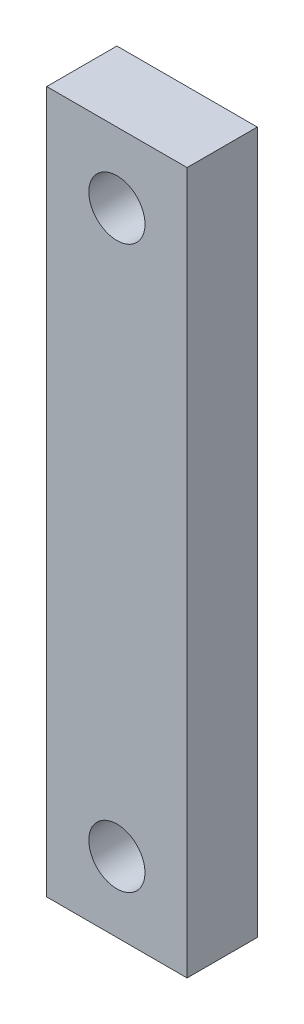
ISO-10303-21;
HEADER;
FILE_DESCRIPTION(('STEP AP214'),'2;1');
FILE_NAME('part.step','',(''),(''),'','','');
FILE_SCHEMA(('AUTOMOTIVE_DESIGN { 1 0 10303 214 1 1 1 1 }'));
ENDSEC;
DATA;
#1=APPLICATION_CONTEXT('core data for automotive mechanical design processes');
#2=APPLICATION_PROTOCOL_DEFINITION('international standard','automotive_design',2000,#1);
#3=PRODUCT_CONTEXT('',#1,'mechanical');
#4=PRODUCT('Part','Part','',(#3));
#5=PRODUCT_RELATED_PRODUCT_CATEGORY('part','',(#4));
#6=PRODUCT_DEFINITION_FORMATION('','',#4);
#7=PRODUCT_DEFINITION_CONTEXT('part definition',#1,'design');
#8=PRODUCT_DEFINITION('design','',#6,#7);
#9=PRODUCT_DEFINITION_SHAPE('','',#8);
#10=(LENGTH_UNIT() NAMED_UNIT(*) SI_UNIT(.MILLI.,.METRE.));
#11=(NAMED_UNIT(*) PLANE_ANGLE_UNIT() SI_UNIT($,.RADIAN.));
#12=(NAMED_UNIT(*) SI_UNIT($,.STERADIAN.) SOLID_ANGLE_UNIT());
#13=UNCERTAINTY_MEASURE_WITH_UNIT(LENGTH_MEASURE(1.E-05),#10,'distance_accuracy_value','');
#14=(GEOMETRIC_REPRESENTATION_CONTEXT(3) GLOBAL_UNCERTAINTY_ASSIGNED_CONTEXT((#13)) GLOBAL_UNIT_ASSIGNED_CONTEXT((#10,
#11,#12)) REPRESENTATION_CONTEXT('',''));
#15=CARTESIAN_POINT('',(0.,0.,0.));
#16=DIRECTION('',(0.,0.,1.));
#17=DIRECTION('',(1.,0.,0.));
#18=AXIS2_PLACEMENT_3D('',#15,#16,#17);
#19=CARTESIAN_POINT('',(0.,0.,10.));
#20=DIRECTION('',(1.,0.,0.));
#21=DIRECTION('',(0.,0.,-1.));
#22=AXIS2_PLACEMENT_3D('',#19,#20,#21);
#23=PLANE('',#22);
#24=DIRECTION('',(0.,-1.,0.));
#25=VECTOR('',#24,1.);
#26=CARTESIAN_POINT('',(0.,0.,0.));
#27=LINE('',#26,#25);
#28=CARTESIAN_POINT('',(0.,100.,0.));
#29=VERTEX_POINT('',#28);
#30=CARTESIAN_POINT('',(0.,0.,0.));
#31=VERTEX_POINT('',#30);
#32=EDGE_CURVE('E107',#29,#31,#27,.T.);
#33=ORIENTED_EDGE('',*,*,#32,.T.);
#34=DIRECTION('',(0.,0.,-1.));
#35=VECTOR('',#34,1.);
#36=CARTESIAN_POINT('',(0.,0.,10.));
#37=LINE('',#36,#35);
#38=CARTESIAN_POINT('',(0.,0.,10.));
#39=VERTEX_POINT('',#38);
#40=EDGE_CURVE('E11',#39,#31,#37,.T.);
#41=ORIENTED_EDGE('',*,*,#40,.F.);
#42=DIRECTION('',(0.,-1.,0.));
#43=VECTOR('',#42,1.);
#44=CARTESIAN_POINT('',(0.,0.,10.));
#45=LINE('',#44,#43);
#46=CARTESIAN_POINT('',(0.,100.,10.));
#47=VERTEX_POINT('',#46);
#48=EDGE_CURVE('E91',#47,#39,#45,.T.);
#49=ORIENTED_EDGE('',*,*,#48,.F.);
#50=DIRECTION('',(0.,0.,-1.));
#51=VECTOR('',#50,1.);
#52=CARTESIAN_POINT('',(0.,100.,10.));
#53=LINE('',#52,#51);
#54=EDGE_CURVE('E103',#47,#29,#53,.T.);
#55=ORIENTED_EDGE('',*,*,#54,.T.);
#56=EDGE_LOOP('',(#33,#41,#49,#55));
#57=FACE_BOUND('',#56,.T.);
#58=ADVANCED_FACE('F39',(#57),#23,.F.);
#59=CARTESIAN_POINT('',(0.,0.,10.));
#60=DIRECTION('',(0.,1.,0.));
#61=DIRECTION('',(0.,0.,1.));
#62=AXIS2_PLACEMENT_3D('',#59,#60,#61);
#63=PLANE('',#62);
#64=DIRECTION('',(1.,0.,0.));
#65=VECTOR('',#64,1.);
#66=CARTESIAN_POINT('',(0.,0.,0.));
#67=LINE('',#66,#65);
#68=CARTESIAN_POINT('',(20.,0.,0.));
#69=VERTEX_POINT('',#68);
#70=EDGE_CURVE('E96',#31,#69,#67,.T.);
#71=ORIENTED_EDGE('',*,*,#70,.T.);
#72=DIRECTION('',(0.,0.,-1.));
#73=VECTOR('',#72,1.);
#74=CARTESIAN_POINT('',(20.,0.,10.));
#75=LINE('',#74,#73);
#76=CARTESIAN_POINT('',(20.,0.,10.));
#77=VERTEX_POINT('',#76);
#78=EDGE_CURVE('E48',#77,#69,#75,.T.);
#79=ORIENTED_EDGE('',*,*,#78,.F.);
#80=DIRECTION('',(1.,0.,0.));
#81=VECTOR('',#80,1.);
#82=CARTESIAN_POINT('',(0.,0.,10.));
#83=LINE('',#82,#81);
#84=EDGE_CURVE('E86',#39,#77,#83,.T.);
#85=ORIENTED_EDGE('',*,*,#84,.F.);
#86=ORIENTED_EDGE('',*,*,#40,.T.);
#87=EDGE_LOOP('',(#71,#79,#85,#86));
#88=FACE_BOUND('',#87,.T.);
#89=ADVANCED_FACE('F95',(#88),#63,.F.);
#90=CARTESIAN_POINT('',(20.,0.,10.));
#91=DIRECTION('',(-1.,0.,0.));
#92=DIRECTION('',(0.,0.,1.));
#93=AXIS2_PLACEMENT_3D('',#90,#91,#92);
#94=PLANE('',#93);
#95=DIRECTION('',(0.,1.,0.));
#96=VECTOR('',#95,1.);
#97=CARTESIAN_POINT('',(20.,0.,0.));
#98=LINE('',#97,#96);
#99=CARTESIAN_POINT('',(20.,100.,0.));
#100=VERTEX_POINT('',#99);
#101=EDGE_CURVE('E73',#69,#100,#98,.T.);
#102=ORIENTED_EDGE('',*,*,#101,.T.);
#103=DIRECTION('',(0.,0.,-1.));
#104=VECTOR('',#103,1.);
#105=CARTESIAN_POINT('',(20.,100.,10.));
#106=LINE('',#105,#104);
#107=CARTESIAN_POINT('',(20.,100.,10.));
#108=VERTEX_POINT('',#107);
#109=EDGE_CURVE('E98',#108,#100,#106,.T.);
#110=ORIENTED_EDGE('',*,*,#109,.F.);
#111=DIRECTION('',(0.,1.,0.));
#112=VECTOR('',#111,1.);
#113=CARTESIAN_POINT('',(20.,0.,10.));
#114=LINE('',#113,#112);
#115=EDGE_CURVE('E89',#77,#108,#114,.T.);
#116=ORIENTED_EDGE('',*,*,#115,.F.);
#117=ORIENTED_EDGE('',*,*,#78,.T.);
#118=EDGE_LOOP('',(#102,#110,#116,#117));
#119=FACE_BOUND('',#118,.T.);
#120=ADVANCED_FACE('F99',(#119),#94,.F.);
#121=CARTESIAN_POINT('',(0.,100.,10.));
#122=DIRECTION('',(0.,-1.,0.));
#123=DIRECTION('',(0.,0.,-1.));
#124=AXIS2_PLACEMENT_3D('',#121,#122,#123);
#125=PLANE('',#124);
#126=DIRECTION('',(-1.,0.,0.));
#127=VECTOR('',#126,1.);
#128=CARTESIAN_POINT('',(0.,100.,0.));
#129=LINE('',#128,#127);
#130=EDGE_CURVE('E79',#100,#29,#129,.T.);
#131=ORIENTED_EDGE('',*,*,#130,.T.);
#132=ORIENTED_EDGE('',*,*,#54,.F.);
#133=DIRECTION('',(-1.,0.,0.));
#134=VECTOR('',#133,1.);
#135=CARTESIAN_POINT('',(0.,100.,10.));
#136=LINE('',#135,#134);
#137=EDGE_CURVE('E56',#108,#47,#136,.T.);
#138=ORIENTED_EDGE('',*,*,#137,.F.);
#139=ORIENTED_EDGE('',*,*,#109,.T.);
#140=EDGE_LOOP('',(#131,#132,#138,#139));
#141=FACE_BOUND('',#140,.T.);
#142=ADVANCED_FACE('F121',(#141),#125,.F.);
#143=CARTESIAN_POINT('',(0.,0.,10.));
#144=DIRECTION('',(0.,0.,-1.));
#145=DIRECTION('',(-1.,0.,0.));
#146=AXIS2_PLACEMENT_3D('',#143,#144,#145);
#147=PLANE('',#146);
#148=CARTESIAN_POINT('',(10.,10.,10.));
#149=DIRECTION('',(0.,0.,1.));
#150=DIRECTION('',(-1.,0.,0.));
#151=AXIS2_PLACEMENT_3D('',#148,#149,#150);
#152=CIRCLE('',#151,4.);
#153=CARTESIAN_POINT('',(6.,10.,10.));
#154=VERTEX_POINT('',#153);
#155=EDGE_CURVE('E136',#154,#154,#152,.T.);
#156=ORIENTED_EDGE('',*,*,#155,.F.);
#157=EDGE_LOOP('',(#156));
#158=FACE_BOUND('',#157,.T.);
#159=CARTESIAN_POINT('',(10.,90.,10.));
#160=DIRECTION('',(0.,0.,1.));
#161=DIRECTION('',(1.,0.,0.));
#162=AXIS2_PLACEMENT_3D('',#159,#160,#161);
#163=CIRCLE('',#162,4.);
#164=CARTESIAN_POINT('',(14.,90.,10.));
#165=VERTEX_POINT('',#164);
#166=EDGE_CURVE('E128',#165,#165,#163,.T.);
#167=ORIENTED_EDGE('',*,*,#166,.F.);
#168=EDGE_LOOP('',(#167));
#169=FACE_BOUND('',#168,.T.);
#170=ORIENTED_EDGE('',*,*,#48,.T.);
#171=ORIENTED_EDGE('',*,*,#84,.T.);
#172=ORIENTED_EDGE('',*,*,#115,.T.);
#173=ORIENTED_EDGE('',*,*,#137,.T.);
#174=EDGE_LOOP('',(#170,#171,#172,#173));
#175=FACE_BOUND('',#174,.T.);
#176=ADVANCED_FACE('F87',(#158,#169,#175),#147,.F.);
#177=CARTESIAN_POINT('',(0.,0.,0.));
#178=DIRECTION('',(0.,0.,-1.));
#179=DIRECTION('',(-1.,0.,0.));
#180=AXIS2_PLACEMENT_3D('',#177,#178,#179);
#181=PLANE('',#180);
#182=CARTESIAN_POINT('',(10.,10.,0.));
#183=DIRECTION('',(0.,0.,1.));
#184=DIRECTION('',(-1.,0.,0.));
#185=AXIS2_PLACEMENT_3D('',#182,#183,#184);
#186=CIRCLE('',#185,4.);
#187=CARTESIAN_POINT('',(6.,10.,0.));
#188=VERTEX_POINT('',#187);
#189=EDGE_CURVE('E132',#188,#188,#186,.T.);
#190=ORIENTED_EDGE('',*,*,#189,.T.);
#191=EDGE_LOOP('',(#190));
#192=FACE_BOUND('',#191,.T.);
#193=CARTESIAN_POINT('',(10.,90.,0.));
#194=DIRECTION('',(0.,0.,1.));
#195=DIRECTION('',(1.,0.,0.));
#196=AXIS2_PLACEMENT_3D('',#193,#194,#195);
#197=CIRCLE('',#196,4.);
#198=CARTESIAN_POINT('',(14.,90.,0.));
#199=VERTEX_POINT('',#198);
#200=EDGE_CURVE('E111',#199,#199,#197,.T.);
#201=ORIENTED_EDGE('',*,*,#200,.T.);
#202=EDGE_LOOP('',(#201));
#203=FACE_BOUND('',#202,.T.);
#204=ORIENTED_EDGE('',*,*,#32,.F.);
#205=ORIENTED_EDGE('',*,*,#130,.F.);
#206=ORIENTED_EDGE('',*,*,#101,.F.);
#207=ORIENTED_EDGE('',*,*,#70,.F.);
#208=EDGE_LOOP('',(#204,#205,#206,#207));
#209=FACE_BOUND('',#208,.T.);
#210=ADVANCED_FACE('F124',(#192,#203,#209),#181,.T.);
#211=CARTESIAN_POINT('',(10.,90.,0.));
#212=DIRECTION('',(0.,0.,1.));
#213=DIRECTION('',(1.,0.,0.));
#214=AXIS2_PLACEMENT_3D('',#211,#212,#213);
#215=CYLINDRICAL_SURFACE('',#214,4.);
#216=ORIENTED_EDGE('',*,*,#200,.F.);
#217=EDGE_LOOP('',(#216));
#218=FACE_BOUND('',#217,.T.);
#219=ORIENTED_EDGE('',*,*,#166,.T.);
#220=EDGE_LOOP('',(#219));
#221=FACE_BOUND('',#220,.T.);
#222=ADVANCED_FACE('F149',(#218,#221),#215,.F.);
#223=CARTESIAN_POINT('',(10.,10.,0.));
#224=DIRECTION('',(0.,0.,1.));
#225=DIRECTION('',(1.,0.,0.));
#226=AXIS2_PLACEMENT_3D('',#223,#224,#225);
#227=CYLINDRICAL_SURFACE('',#226,4.);
#228=ORIENTED_EDGE('',*,*,#189,.F.);
#229=EDGE_LOOP('',(#228));
#230=FACE_BOUND('',#229,.T.);
#231=ORIENTED_EDGE('',*,*,#155,.T.);
#232=EDGE_LOOP('',(#231));
#233=FACE_BOUND('',#232,.T.);
#234=ADVANCED_FACE('F146',(#230,#233),#227,.F.);
#235=CLOSED_SHELL('',(#58,#89,#120,#142,#176,#210,#222,#234));
#236=MANIFOLD_SOLID_BREP('B2',#235);
#237=ADVANCED_BREP_SHAPE_REPRESENTATION('',(#18,#236),#14);
#238=SHAPE_DEFINITION_REPRESENTATION(#9,#237);
ENDSEC;
END-ISO-10303-21;
